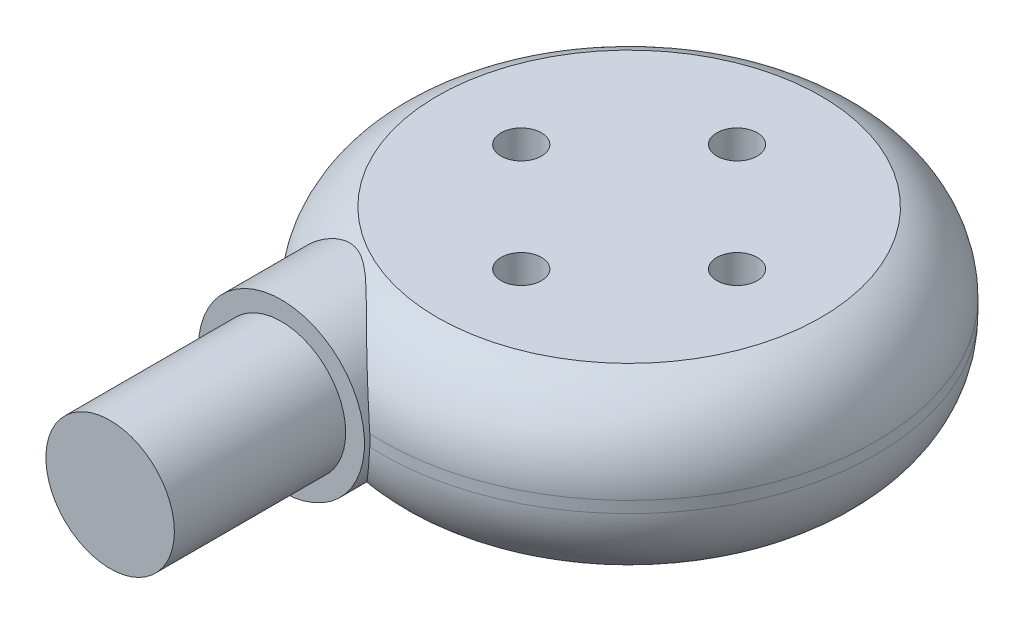
ISO-10303-21;
HEADER;
FILE_DESCRIPTION(('STEP AP214'),'2;1');
FILE_NAME('part.step','',(''),(''),'','','');
FILE_SCHEMA(('AUTOMOTIVE_DESIGN { 1 0 10303 214 1 1 1 1 }'));
ENDSEC;
DATA;
#1=APPLICATION_CONTEXT('core data for automotive mechanical design processes');
#2=APPLICATION_PROTOCOL_DEFINITION('international standard','automotive_design',2000,#1);
#3=PRODUCT_CONTEXT('',#1,'mechanical');
#4=PRODUCT('Part','Part','',(#3));
#5=PRODUCT_RELATED_PRODUCT_CATEGORY('part','',(#4));
#6=PRODUCT_DEFINITION_FORMATION('','',#4);
#7=PRODUCT_DEFINITION_CONTEXT('part definition',#1,'design');
#8=PRODUCT_DEFINITION('design','',#6,#7);
#9=PRODUCT_DEFINITION_SHAPE('','',#8);
#10=(LENGTH_UNIT() NAMED_UNIT(*) SI_UNIT(.MILLI.,.METRE.));
#11=(NAMED_UNIT(*) PLANE_ANGLE_UNIT() SI_UNIT($,.RADIAN.));
#12=(NAMED_UNIT(*) SI_UNIT($,.STERADIAN.) SOLID_ANGLE_UNIT());
#13=UNCERTAINTY_MEASURE_WITH_UNIT(LENGTH_MEASURE(1.E-05),#10,'distance_accuracy_value','');
#14=(GEOMETRIC_REPRESENTATION_CONTEXT(3) GLOBAL_UNCERTAINTY_ASSIGNED_CONTEXT((#13)) GLOBAL_UNIT_ASSIGNED_CONTEXT((#10,
#11,#12)) REPRESENTATION_CONTEXT('',''));
#15=CARTESIAN_POINT('',(0.,0.,0.));
#16=DIRECTION('',(0.,0.,1.));
#17=DIRECTION('',(1.,0.,0.));
#18=AXIS2_PLACEMENT_3D('',#15,#16,#17);
#19=CARTESIAN_POINT('',(7.11200000000006,-6.35,-18.6683453434298));
#20=DIRECTION('',(0.,1.,0.));
#21=DIRECTION('',(0.,0.,1.));
#22=AXIS2_PLACEMENT_3D('',#19,#20,#21);
#23=CYLINDRICAL_SURFACE('',#22,14.224);
#24=CARTESIAN_POINT('',(7.11200000000006,-6.35,-18.6683453434298));
#25=DIRECTION('',(0.,1.,0.));
#26=DIRECTION('',(0.,0.,1.));
#27=AXIS2_PLACEMENT_3D('',#24,#25,#26);
#28=CIRCLE('',#27,14.224);
#29=CARTESIAN_POINT('',(7.11200000000006,-6.35,-4.44434534342982));
#30=VERTEX_POINT('',#29);
#31=EDGE_CURVE('E77',#30,#30,#28,.T.);
#32=ORIENTED_EDGE('',*,*,#31,.F.);
#33=EDGE_LOOP('',(#32));
#34=FACE_BOUND('',#33,.T.);
#35=CARTESIAN_POINT('',(7.11200000000006,3.81,-18.6683453434298));
#36=DIRECTION('',(0.,1.,0.));
#37=DIRECTION('',(0.,0.,1.));
#38=AXIS2_PLACEMENT_3D('',#35,#36,#37);
#39=CIRCLE('',#38,14.224);
#40=CARTESIAN_POINT('',(7.11200000000006,3.81,-4.44434534342982));
#41=VERTEX_POINT('',#40);
#42=EDGE_CURVE('E11',#41,#41,#39,.F.);
#43=ORIENTED_EDGE('',*,*,#42,.F.);
#44=EDGE_LOOP('',(#43));
#45=FACE_BOUND('',#44,.T.);
#46=ADVANCED_FACE('F35',(#34,#45),#23,.F.);
#47=CARTESIAN_POINT('',(0.,0.,12.7));
#48=DIRECTION('',(0.,0.,-1.));
#49=DIRECTION('',(-1.,0.,0.));
#50=AXIS2_PLACEMENT_3D('',#47,#48,#49);
#51=CYLINDRICAL_SURFACE('',#50,4.7625);
#52=CARTESIAN_POINT('',(0.,0.,12.7));
#53=DIRECTION('',(0.,0.,1.));
#54=DIRECTION('',(1.,0.,0.));
#55=AXIS2_PLACEMENT_3D('',#52,#53,#54);
#56=CIRCLE('',#55,4.7625);
#57=CARTESIAN_POINT('',(4.7625,0.,12.7));
#58=VERTEX_POINT('',#57);
#59=EDGE_CURVE('E73',#58,#58,#56,.T.);
#60=ORIENTED_EDGE('',*,*,#59,.F.);
#61=EDGE_LOOP('',(#60));
#62=FACE_BOUND('',#61,.T.);
#63=CARTESIAN_POINT('',(0.,0.,0.));
#64=DIRECTION('',(0.,0.,1.));
#65=DIRECTION('',(1.,0.,0.));
#66=AXIS2_PLACEMENT_3D('',#63,#64,#65);
#67=CIRCLE('',#66,4.7625);
#68=CARTESIAN_POINT('',(4.7625,0.,0.));
#69=VERTEX_POINT('',#68);
#70=EDGE_CURVE('E89',#69,#69,#67,.T.);
#71=ORIENTED_EDGE('',*,*,#70,.T.);
#72=EDGE_LOOP('',(#71));
#73=FACE_BOUND('',#72,.T.);
#74=ADVANCED_FACE('F110',(#62,#73),#51,.T.);
#75=CARTESIAN_POINT('',(0.,0.,12.7));
#76=DIRECTION('',(0.,0.,1.));
#77=DIRECTION('',(1.,0.,0.));
#78=AXIS2_PLACEMENT_3D('',#75,#76,#77);
#79=PLANE('',#78);
#80=ORIENTED_EDGE('',*,*,#59,.T.);
#81=EDGE_LOOP('',(#80));
#82=FACE_BOUND('',#81,.T.);
#83=ADVANCED_FACE('F106',(#82),#79,.T.);
#84=CARTESIAN_POINT('',(0.,0.,-6.35));
#85=DIRECTION('',(0.,0.,1.));
#86=DIRECTION('',(1.,0.,0.));
#87=AXIS2_PLACEMENT_3D('',#84,#85,#86);
#88=CYLINDRICAL_SURFACE('',#87,6.1595);
#89=CARTESIAN_POINT('',(6.1595,0.,-0.405166875539851));
#90=CARTESIAN_POINT('',(6.15950023475749,0.172517177616441,-0.40516698536337));
#91=CARTESIAN_POINT('',(6.1522480764625,0.345030274570014,-0.405540795162976));
#92=CARTESIAN_POINT('',(6.12329168071194,0.688838513053254,-0.407085513688974));
#93=CARTESIAN_POINT('',(6.10158740172247,0.860133651081204,-0.408256424706152));
#94=CARTESIAN_POINT('',(6.04388592198765,1.2002640638204,-0.411540871268977));
#95=CARTESIAN_POINT('',(6.00789082466917,1.36909969674991,-0.413654268098328));
#96=CARTESIAN_POINT('',(5.92186630327485,1.70313985580206,-0.419060941484881));
#97=CARTESIAN_POINT('',(5.87183676114572,1.86834435136811,-0.422354227967004));
#98=CARTESIAN_POINT('',(5.75808649293658,2.19400055125028,-0.43044217888493));
#99=CARTESIAN_POINT('',(5.69436084303803,2.35445052262439,-0.435237383552032));
#100=CARTESIAN_POINT('',(5.55370157872006,2.66937797328264,-0.446720119026419));
#101=CARTESIAN_POINT('',(5.47676835961368,2.82385563115336,-0.453407593200457));
#102=CARTESIAN_POINT('',(5.31025529055499,3.12575626978201,-0.469124177525595));
#103=CARTESIAN_POINT('',(5.22067284045019,3.27317779173036,-0.478153769438278));
#104=CARTESIAN_POINT('',(5.0296031864806,3.55980123478894,-0.499036181103156));
#105=CARTESIAN_POINT('',(4.92812061110807,3.69900632017738,-0.510887905038089));
#106=CARTESIAN_POINT('',(4.71468948333986,3.96741237441091,-0.537836793831741));
#107=CARTESIAN_POINT('',(4.60280900103588,4.09666950861489,-0.552913589759298));
#108=CARTESIAN_POINT('',(4.36901318058269,4.34514118259427,-0.586837942350733));
#109=CARTESIAN_POINT('',(4.24710161720228,4.46435946619945,-0.605684084367447));
#110=CARTESIAN_POINT('',(3.99422797763476,4.69196334971641,-0.647611102301973));
#111=CARTESIAN_POINT('',(3.86326586609774,4.80034890731335,-0.670691994760591));
#112=CARTESIAN_POINT('',(3.5934179668648,5.00554866584515,-0.721496916497313));
#113=CARTESIAN_POINT('',(3.45453228979066,5.10236302826836,-0.749220880963433));
#114=CARTESIAN_POINT('',(3.17242691607803,5.28229780213224,-0.80914182442154));
#115=CARTESIAN_POINT('',(3.0293181892273,5.36561973619755,-0.841256457690419));
#116=CARTESIAN_POINT('',(2.73777949406721,5.52007478985453,-0.910541659330212));
#117=CARTESIAN_POINT('',(2.5893477176315,5.59120371940267,-0.947713957893792));
#118=CARTESIAN_POINT('',(2.28852441783152,5.72091917836892,-1.02722238841351));
#119=CARTESIAN_POINT('',(2.13613457945877,5.77951094995005,-1.06955635045346));
#120=CARTESIAN_POINT('',(1.82852787773562,5.88407394516104,-1.15944615865331));
#121=CARTESIAN_POINT('',(1.67330997564562,5.93004042768229,-1.20700395713361));
#122=CARTESIAN_POINT('',(1.36006406757813,6.00965825399879,-1.30765823602099));
#123=CARTESIAN_POINT('',(1.20202349972419,6.0432075220632,-1.36079620637294));
#124=CARTESIAN_POINT('',(0.885488633525701,6.09763487453196,-1.47213471049159));
#125=CARTESIAN_POINT('',(0.726994192619633,6.11850840413887,-1.5303370554711));
#126=CARTESIAN_POINT('',(0.410715445989597,6.14784304223325,-1.65151824050047));
#127=CARTESIAN_POINT('',(0.252931055816868,6.15630566789089,-1.71449649572939));
#128=CARTESIAN_POINT('',(-0.0610234414027107,6.16119945592481,-1.84492136909588));
#129=CARTESIAN_POINT('',(-0.217192913762839,6.15762605570917,-1.91236967222985));
#130=CARTESIAN_POINT('',(-0.538501915397839,6.13817883439698,-2.05648209340827));
#131=CARTESIAN_POINT('',(-0.703447799578635,6.12141248465616,-2.13345871167567));
#132=CARTESIAN_POINT('',(-1.02953699335835,6.07508392730548,-2.29155604748293));
#133=CARTESIAN_POINT('',(-1.19067886502304,6.0455169601635,-2.37267829654866));
#134=CARTESIAN_POINT('',(-1.66712785278035,5.93851757125521,-2.62135721659478));
#135=CARTESIAN_POINT('',(-1.97567651526417,5.84277207016474,-2.79432442769908));
#136=CARTESIAN_POINT('',(-2.6089697447446,5.5914151073666,-3.17294211280872));
#137=CARTESIAN_POINT('',(-2.93042205731185,5.42954118384211,-3.37988218835844));
#138=CARTESIAN_POINT('',(-3.53954567066901,5.05364912327975,-3.79783843479704));
#139=CARTESIAN_POINT('',(-3.82715302757868,4.83953455934721,-4.00886147120846));
#140=CARTESIAN_POINT('',(-4.24436252962896,4.46818882695183,-4.33238153158598));
#141=CARTESIAN_POINT('',(-4.38750919959234,4.32779060434912,-4.44710418140419));
#142=CARTESIAN_POINT('',(-4.66091656701009,4.03185963674266,-4.67260624702949));
#143=CARTESIAN_POINT('',(-4.79117335291069,3.87632232587316,-4.78338445937179));
#144=CARTESIAN_POINT('',(-5.03728504187811,3.55059943666415,-4.99821556795551));
#145=CARTESIAN_POINT('',(-5.1531721280371,3.38044809153186,-5.10228323282625));
#146=CARTESIAN_POINT('',(-5.36928483020561,3.02546015989003,-5.30084764433183));
#147=CARTESIAN_POINT('',(-5.46952244252745,2.84063498739204,-5.39535170233027));
#148=CARTESIAN_POINT('',(-5.67102065013492,2.41748747993959,-5.58902634448849));
#149=CARTESIAN_POINT('',(-5.7684076147289,2.1758950642383,-5.68529176201641));
#150=CARTESIAN_POINT('',(-5.89215829822243,1.79982128494006,-5.80964199742577));
#151=CARTESIAN_POINT('',(-5.92968280036188,1.67220339930003,-5.84774639491108));
#152=CARTESIAN_POINT('',(-5.99675130579239,1.41291094815217,-5.91633057981896));
#153=CARTESIAN_POINT('',(-6.02629930370982,1.28123845013683,-5.94681418316109));
#154=CARTESIAN_POINT('',(-6.07713659255756,1.01323369156753,-5.99952606463506));
#155=CARTESIAN_POINT('',(-6.09833908496332,0.876867715689922,-6.02166748230484));
#156=CARTESIAN_POINT('',(-6.13159348882475,0.601817592629502,-6.05649538938141));
#157=CARTESIAN_POINT('',(-6.1436456388142,0.463133505972202,-6.06918212525543));
#158=CARTESIAN_POINT('',(-6.15830424248134,0.18477862022379,-6.08462233121333));
#159=CARTESIAN_POINT('',(-6.16091527705851,0.0451083326158347,-6.08738061865136));
#160=CARTESIAN_POINT('',(-6.15663775760271,-0.23391574436752,-6.08286934781583));
#161=CARTESIAN_POINT('',(-6.14974997162146,-0.373269558419653,-6.07560060030413));
#162=CARTESIAN_POINT('',(-6.12815168667006,-0.632322775981833,-6.05289714788108));
#163=CARTESIAN_POINT('',(-6.11457348857131,-0.752223991800105,-6.03864575530891));
#164=CARTESIAN_POINT('',(-6.08060229828112,-0.990029875168638,-6.00316547452577));
#165=CARTESIAN_POINT('',(-6.06020718273657,-1.10793390859311,-5.98193441230109));
#166=CARTESIAN_POINT('',(-5.98926396257916,-1.45762005954871,-5.90854393893564));
#167=CARTESIAN_POINT('',(-5.92895129746465,-1.68545292352423,-5.84667999018045));
#168=CARTESIAN_POINT('',(-5.75840893711857,-2.20954414519092,-5.67516037066207));
#169=CARTESIAN_POINT('',(-5.63794204482358,-2.49942789176608,-5.55628248772822));
#170=CARTESIAN_POINT('',(-5.43040675973351,-2.91099600995392,-5.35864138797804));
#171=CARTESIAN_POINT('',(-5.35661847254862,-3.044500809898,-5.28941606894584));
#172=CARTESIAN_POINT('',(-5.20075931763147,-3.30369068164233,-5.14584174094385));
#173=CARTESIAN_POINT('',(-5.11869046278422,-3.42937764189439,-5.07149397855215));
#174=CARTESIAN_POINT('',(-4.91942291369493,-3.71179326448826,-4.89450120235428));
#175=CARTESIAN_POINT('',(-4.79937941112118,-3.8656051378173,-4.79040639266603));
#176=CARTESIAN_POINT('',(-4.54703474164461,-4.15949944018826,-4.57774209620408));
#177=CARTESIAN_POINT('',(-4.41472993503976,-4.29957776694317,-4.46917128609752));
#178=CARTESIAN_POINT('',(-4.13869264377951,-4.56590153154826,-4.24946921086118));
#179=CARTESIAN_POINT('',(-3.99495568023593,-4.69214150128575,-4.13833695443907));
#180=CARTESIAN_POINT('',(-3.69683001116591,-4.93044619011836,-3.91521671587624));
#181=CARTESIAN_POINT('',(-3.54244223806373,-5.04251214764863,-3.8032288094047));
#182=CARTESIAN_POINT('',(-3.22184876193579,-5.25322157277965,-3.57857209796581));
#183=CARTESIAN_POINT('',(-3.0555292003672,-5.35169899962334,-3.46590990518232));
#184=CARTESIAN_POINT('',(-2.71334554917429,-5.53305387428658,-3.24254649940941));
#185=CARTESIAN_POINT('',(-2.53748200732433,-5.61593221619432,-3.13184517435919));
#186=CARTESIAN_POINT('',(-2.17702058829421,-5.76524638203093,-2.91368229468174));
#187=CARTESIAN_POINT('',(-1.99242457171534,-5.83168568994521,-2.80622005782949));
#188=CARTESIAN_POINT('',(-1.61541927596263,-5.94716076340095,-2.5957071103738));
#189=CARTESIAN_POINT('',(-1.42301021089174,-5.99619700548487,-2.49265627904226));
#190=CARTESIAN_POINT('',(-1.03182761869835,-6.07573458462974,-2.29222731875925));
#191=CARTESIAN_POINT('',(-0.833062913781452,-6.10626053218913,-2.19484181396188));
#192=CARTESIAN_POINT('',(-0.430408159210808,-6.1477756130053,-2.00664077392042));
#193=CARTESIAN_POINT('',(-0.226517965916951,-6.15876419811357,-1.91582542307993));
#194=CARTESIAN_POINT('',(0.184353747044207,-6.16016364567831,-1.74178667589674));
#195=CARTESIAN_POINT('',(0.391332258923024,-6.15059337811751,-1.65855639068361));
#196=CARTESIAN_POINT('',(0.806352356554719,-6.11004741154603,-1.5003800762809));
#197=CARTESIAN_POINT('',(1.01439371769442,-6.07907606345436,-1.42543236680478));
#198=CARTESIAN_POINT('',(1.3995703346497,-6.00113238224167,-1.29438698303394));
#199=CARTESIAN_POINT('',(1.5768994884303,-5.95705653947525,-1.23712383406193));
#200=CARTESIAN_POINT('',(1.92876366658994,-5.8526042027949,-1.1292790175091));
#201=CARTESIAN_POINT('',(2.10329902598512,-5.79222967907562,-1.07869654346403));
#202=CARTESIAN_POINT('',(2.44768540203062,-5.65531598546538,-0.98425680607376));
#203=CARTESIAN_POINT('',(2.61753870456748,-5.57878486748182,-0.940396211490997));
#204=CARTESIAN_POINT('',(2.95081921597314,-5.40989799581291,-0.859220366848548));
#205=CARTESIAN_POINT('',(3.11424686145073,-5.31754331959491,-0.821904671479486));
#206=CARTESIAN_POINT('',(3.41642095058297,-5.12795876749887,-0.757035876964892));
#207=CARTESIAN_POINT('',(3.5559732601312,-5.0322174360024,-0.728872542217408));
#208=CARTESIAN_POINT('',(3.82725686009219,-4.82910468592101,-0.677223333869792));
#209=CARTESIAN_POINT('',(3.95898853125678,-4.72173383424531,-0.653737232424843));
#210=CARTESIAN_POINT('',(4.21347834134685,-4.49610464427745,-0.611043014226748));
#211=CARTESIAN_POINT('',(4.33623781163343,-4.37784792721828,-0.591834261899782));
#212=CARTESIAN_POINT('',(4.57177868112596,-4.13126502095225,-0.557232914263276));
#213=CARTESIAN_POINT('',(4.68455992634275,-4.00293867640331,-0.541840377840958));
#214=CARTESIAN_POINT('',(4.89735508113266,-3.73945594962283,-0.514623927462918));
#215=CARTESIAN_POINT('',(4.99755690633777,-3.60445714673233,-0.502742610710782));
#216=CARTESIAN_POINT('',(5.18670641381319,-3.32652702790444,-0.481722510669947));
#217=CARTESIAN_POINT('',(5.27565037507406,-3.18359311155101,-0.472584632795278));
#218=CARTESIAN_POINT('',(5.44158939529478,-2.89082313237553,-0.456601213080544));
#219=CARTESIAN_POINT('',(5.5185841103889,-2.74098687108423,-0.449755737202809));
#220=CARTESIAN_POINT('',(5.66006944943233,-2.43544680373671,-0.437934400055751));
#221=CARTESIAN_POINT('',(5.7245594225978,-2.2797426928036,-0.432958636079146));
#222=CARTESIAN_POINT('',(5.84472184742326,-1.95223509721501,-0.424199943573725));
#223=CARTESIAN_POINT('',(5.89943554320822,-1.78007603278038,-0.420527593826768));
#224=CARTESIAN_POINT('',(5.99354489954996,-1.43158665013316,-0.414517598263686));
#225=CARTESIAN_POINT('',(6.03293925783539,-1.25525597865027,-0.412180065910252));
#226=CARTESIAN_POINT('',(6.09608975452564,-0.899834789318706,-0.40855694915782));
#227=CARTESIAN_POINT('',(6.11984839233364,-0.72074471725249,-0.40727119662159));
#228=CARTESIAN_POINT('',(6.15155612530695,-0.361101929678388,-0.405575950862688));
#229=CARTESIAN_POINT('',(6.15949975431336,-0.180548730109972,-0.405166760603488));
#230=CARTESIAN_POINT('',(6.1595,0.,-0.405166875539851));
#231=B_SPLINE_CURVE_WITH_KNOTS('',3,(#89,#90,#91,#92,#93,#94,#95,#96,#97,#98,#99,#100,#101,#102,
#103,#104,#105,#106,#107,#108,#109,#110,#111,#112,#113,#114,#115,#116,#117,#118,#119,#120,#121,
#122,#123,#124,#125,#126,#127,#128,#129,#130,#131,#132,#133,#134,#135,#136,#137,#138,#139,#140,
#141,#142,#143,#144,#145,#146,#147,#148,#149,#150,#151,#152,#153,#154,#155,#156,#157,#158,#159,
#160,#161,#162,#163,#164,#165,#166,#167,#168,#169,#170,#171,#172,#173,#174,#175,#176,#177,#178,
#179,#180,#181,#182,#183,#184,#185,#186,#187,#188,#189,#190,#191,#192,#193,#194,#195,#196,#197,
#198,#199,#200,#201,#202,#203,#204,#205,#206,#207,#208,#209,#210,#211,#212,#213,#214,#215,#216,
#217,#218,#219,#220,#221,#222,#223,#224,#225,#226,#227,#228,#229,#230),.UNSPECIFIED.,.T.,.F.,(4,
2,2,2,2,2,2,2,2,2,2,2,2,2,2,2,2,2,2,2,2,2,2,2,2,2,2,2,2,2,2,2,2,2,2,2,2,2,2,2,2,2,2,2,2,2,2,2,2,
2,2,2,2,2,2,2,2,2,2,2,2,2,2,2,2,2,2,2,2,2,4),(0.,0.517391943642746,1.03478537422278,
1.55210267927977,2.06942433597609,2.58693228439252,3.10442474608471,3.62202373784692,
4.1394220757596,4.65364433268318,5.1676739613323,5.68170559780802,6.19573005958676,
6.70117845907686,7.20680020579844,7.71221012192571,8.21780957330277,8.7274775558242,
9.23732857011914,9.74711725251241,10.2570992062967,10.804900645386,11.3529059434533,
12.4482044859175,13.688984585885,14.9320725049791,15.6243553091678,16.3168475528266,
17.0077597142071,17.6981396193225,18.5278043656203,18.9425078344834,19.3570032332959,
19.7757024166661,20.1943906848902,20.6128757751687,21.031327029736,21.395425563538,
21.7596376136534,22.4878324796032,23.4890661195517,23.9912660481324,24.493344192022,
25.1558817036454,25.8186165197891,26.481612273273,27.1445500583224,27.8149814052568,
28.4853743135635,29.1556250210848,29.825857373934,30.4951966493068,31.1645547036488,
31.8332986489208,32.5019066760557,33.0755765638006,33.6491771370018,34.2224925188167,
34.7957688775958,35.3098394382693,35.8238849505925,36.3378540295459,36.8518310389542,
37.3568700998369,37.8620756554291,38.3672957467234,38.8725421241164,39.4138747944515,
39.9552534725199,40.4965455890204,41.038024760454),.UNSPECIFIED.);
#232=CARTESIAN_POINT('',(6.14476807858262,-0.425752874837175,-0.405941164072959));
#233=VERTEX_POINT('',#232);
#234=CARTESIAN_POINT('',(6.14476807858262,0.425752874837175,-0.405941164072959));
#235=VERTEX_POINT('',#234);
#236=EDGE_CURVE('E70',#233,#235,#231,.T.);
#237=ORIENTED_EDGE('',*,*,#236,.T.);
#238=CARTESIAN_POINT('',(6.14476807858262,0.425752874837175,-0.405941164072957));
#239=CARTESIAN_POINT('',(6.13530208580406,0.56288340509565,-0.406415114659884));
#240=CARTESIAN_POINT('',(6.12118010591251,0.699646205187014,-0.411644664773204));
#241=CARTESIAN_POINT('',(6.08398773758386,0.971173687146657,-0.43129993511688));
#242=CARTESIAN_POINT('',(6.06092451745192,1.10593988008848,-0.445718294509901));
#243=CARTESIAN_POINT('',(6.00642152950099,1.37134110056123,-0.483283126786642));
#244=CARTESIAN_POINT('',(5.97505205769644,1.50200095459201,-0.50635700071804));
#245=CARTESIAN_POINT('',(5.90438448978411,1.75940185927113,-0.560776141932942));
#246=CARTESIAN_POINT('',(5.86508518933018,1.88614231128258,-0.592122665851642));
#247=CARTESIAN_POINT('',(5.77932133114041,2.13449917715262,-0.662426179288705));
#248=CARTESIAN_POINT('',(5.73288055162776,2.25613094948687,-0.701358023626835));
#249=CARTESIAN_POINT('',(5.63341869550911,2.49413245841472,-0.786296142052627));
#250=CARTESIAN_POINT('',(5.58039503579252,2.61050010478187,-0.832305194927713));
#251=CARTESIAN_POINT('',(5.41229433253896,2.95138226572453,-0.980200297227338));
#252=CARTESIAN_POINT('',(5.28828363561593,3.16740409541408,-1.09187535641053));
#253=CARTESIAN_POINT('',(5.06154240941345,3.51420787691767,-1.29996457514584));
#254=CARTESIAN_POINT('',(4.96336407942572,3.65130546456681,-1.3911252826159));
#255=CARTESIAN_POINT('',(4.75951969992299,3.91330238955681,-1.58236888075097));
#256=CARTESIAN_POINT('',(4.65385046167287,4.0381964776457,-1.68245557577151));
#257=CARTESIAN_POINT('',(4.43629698432069,4.27606720282959,-1.89025708642326));
#258=CARTESIAN_POINT('',(4.32440277444485,4.38902382831518,-1.9979842205789));
#259=CARTESIAN_POINT('',(4.09571131933846,4.60316387272943,-2.21962172283241));
#260=CARTESIAN_POINT('',(3.97891505024339,4.70434962057149,-2.3335308612339));
#261=CARTESIAN_POINT('',(3.68788642482934,4.93840036783235,-2.61872133357434));
#262=CARTESIAN_POINT('',(3.51141175266088,5.06508990055418,-2.7927983573638));
#263=CARTESIAN_POINT('',(3.15157757133287,5.29648982032761,-3.1483678475132));
#264=CARTESIAN_POINT('',(2.96821374294361,5.40118613798102,-3.3298649724879));
#265=CARTESIAN_POINT('',(2.59489001116506,5.59015762929436,-3.69715149553676));
#266=CARTESIAN_POINT('',(2.40492256287339,5.67440850371593,-3.88294571633953));
#267=CARTESIAN_POINT('',(2.11448684624632,5.78611272603308,-4.16159313877036));
#268=CARTESIAN_POINT('',(2.0167772196974,5.82089764464583,-4.25445316557497));
#269=CARTESIAN_POINT('',(1.81918224117857,5.88564650871562,-4.43953105607542));
#270=CARTESIAN_POINT('',(1.71929711745373,5.91561095717847,-4.5317489858107));
#271=CARTESIAN_POINT('',(1.51185077350935,5.972091604319,-4.71934650562611));
#272=CARTESIAN_POINT('',(1.40415564925085,5.99835995712666,-4.8146531423831));
#273=CARTESIAN_POINT('',(1.18523551246571,6.04542742141218,-5.00250036188783));
#274=CARTESIAN_POINT('',(1.07401130790111,6.06622777477427,-5.09504156847694));
#275=CARTESIAN_POINT('',(0.847439937743986,6.10200077996025,-5.27561368454692));
#276=CARTESIAN_POINT('',(0.732102703715935,6.11698655263678,-5.3636543549419));
#277=CARTESIAN_POINT('',(0.496203912803063,6.14062430205376,-5.53339223410678));
#278=CARTESIAN_POINT('',(0.375644114487855,6.1492783935398,-5.61509155269514));
#279=CARTESIAN_POINT('',(0.160205915462936,6.15810277869769,-5.74985794933742));
#280=CARTESIAN_POINT('',(0.0666378809035396,6.15987594371269,-5.80490655947773));
#281=CARTESIAN_POINT('',(-0.123789650992836,6.15899148319317,-5.9089141551424));
#282=CARTESIAN_POINT('',(-0.220647839572797,6.15633559968672,-5.95787552675379));
#283=CARTESIAN_POINT('',(-0.417196101749972,6.14614041904773,-6.04855232921898));
#284=CARTESIAN_POINT('',(-0.516878943309574,6.13861267544709,-6.09028460768941));
#285=CARTESIAN_POINT('',(-0.718668759904325,6.11827040624703,-6.16588022027836));
#286=CARTESIAN_POINT('',(-0.820775633352204,6.10545610183153,-6.1997438835185));
#287=CARTESIAN_POINT('',(-1.02674811768303,6.07421618602845,-6.25942304924304));
#288=CARTESIAN_POINT('',(-1.1306174343381,6.0557768607887,-6.28521856670546));
#289=CARTESIAN_POINT('',(-1.33882351313162,6.01317596901201,-6.32897547032093));
#290=CARTESIAN_POINT('',(-1.44316030830897,5.98901399156421,-6.34693629364619));
#291=CARTESIAN_POINT('',(-1.6516403663822,5.93491027467358,-6.37586417227906));
#292=CARTESIAN_POINT('',(-1.75578198758889,5.90495059003062,-6.38680904590354));
#293=CARTESIAN_POINT('',(-1.96276239626946,5.83941779113646,-6.4026822982252));
#294=CARTESIAN_POINT('',(-2.06560070305519,5.80384266735613,-6.40760851756255));
#295=CARTESIAN_POINT('',(-2.31103865170313,5.71157152345924,-6.4135874245003));
#296=CARTESIAN_POINT('',(-2.45269037013238,5.65218943325297,-6.4122304541092));
#297=CARTESIAN_POINT('',(-2.73097953285079,5.52311044454514,-6.40271278767443));
#298=CARTESIAN_POINT('',(-2.86761489676241,5.45340932552664,-6.39454930138534));
#299=CARTESIAN_POINT('',(-3.13512351751645,5.30414116405948,-6.37378205224865));
#300=CARTESIAN_POINT('',(-3.2659932750125,5.22456823888062,-6.36117563348722));
#301=CARTESIAN_POINT('',(-3.52125900940452,5.05604299920362,-6.33337332145515));
#302=CARTESIAN_POINT('',(-3.64565444357585,4.96708990027673,-6.31817721155279));
#303=CARTESIAN_POINT('',(-3.89137180648165,4.77719157109849,-6.2861060219712));
#304=CARTESIAN_POINT('',(-4.0124583816535,4.67594830810758,-6.2691921774652));
#305=CARTESIAN_POINT('',(-4.24650770736908,4.46446963312788,-6.23534399811305));
#306=CARTESIAN_POINT('',(-4.35947022255367,4.35423396082063,-6.21840966268771));
#307=CARTESIAN_POINT('',(-4.57663305769694,4.12537800967587,-6.18547632984934));
#308=CARTESIAN_POINT('',(-4.68083612569614,4.00676038210824,-6.16947703957476));
#309=CARTESIAN_POINT('',(-4.87992276560394,3.7617433620179,-6.13916318389054));
#310=CARTESIAN_POINT('',(-4.97480624516181,3.63534389240265,-6.12484863517525));
#311=CARTESIAN_POINT('',(-5.16377715961077,3.36230867989612,-6.09718278391041));
#312=CARTESIAN_POINT('',(-5.25681434402162,3.21491899102331,-6.08407516720747));
#313=CARTESIAN_POINT('',(-5.43012678652196,2.91264580054574,-6.0613077449657));
#314=CARTESIAN_POINT('',(-5.51040723547581,2.75776538064301,-6.05164653504119));
#315=CARTESIAN_POINT('',(-5.65759677320975,2.44160452972939,-6.03629430068992));
#316=CARTESIAN_POINT('',(-5.72450787174175,2.28032506503248,-6.03060267921264));
#317=CARTESIAN_POINT('',(-5.84440036095606,1.95265536224069,-6.02361291928215));
#318=CARTESIAN_POINT('',(-5.89738661418912,1.78626693092347,-6.02231324527748));
#319=CARTESIAN_POINT('',(-5.99631554270848,1.4228397574083,-6.02461477377781));
#320=CARTESIAN_POINT('',(-6.03980656374481,1.22512680829777,-6.0290263322828));
#321=CARTESIAN_POINT('',(-6.09025789091843,0.92649603218879,-6.0406959750025));
#322=CARTESIAN_POINT('',(-6.10460688513783,0.826665496331153,-6.04542383802959));
#323=CARTESIAN_POINT('',(-6.12838221714958,0.626516743933342,-6.05659785411118));
#324=CARTESIAN_POINT('',(-6.13780860985404,0.526198532845834,-6.06304398799697));
#325=CARTESIAN_POINT('',(-6.14476807858262,0.425752874837176,-6.07036756480712));
#326=B_SPLINE_CURVE_WITH_KNOTS('',3,(#238,#239,#240,#241,#242,#243,#244,#245,#246,#247,#248,
#249,#250,#251,#252,#253,#254,#255,#256,#257,#258,#259,#260,#261,#262,#263,#264,#265,#266,#267,
#268,#269,#270,#271,#272,#273,#274,#275,#276,#277,#278,#279,#280,#281,#282,#283,#284,#285,#286,
#287,#288,#289,#290,#291,#292,#293,#294,#295,#296,#297,#298,#299,#300,#301,#302,#303,#304,#305,
#306,#307,#308,#309,#310,#311,#312,#313,#314,#315,#316,#317,#318,#319,#320,#321,#322,#323,#324,
#325),.UNSPECIFIED.,.F.,.F.,(4,2,2,2,2,2,2,2,2,2,2,2,2,2,2,2,2,2,2,2,2,2,2,2,2,2,2,2,2,2,2,2,2,
2,2,2,2,2,2,2,2,2,2,4),(0.,0.412170963115568,0.824012164638293,1.23247356098038,
1.64099703932801,2.04818863055543,2.4555405110789,3.2711314881922,3.84552970561045,
4.42017391875967,4.99576665797769,5.57124531956467,6.40511684346127,7.23952019416409,
8.07491042214265,8.49246946461107,8.90998490738026,9.34840994380522,9.78673531956464,
10.2240657615304,10.661250070848,10.9867120159266,11.3120459808908,11.6366112351431,
11.9611629113166,12.2865122583328,12.6118849739073,12.9382813818645,13.2647948592661,
13.7249069033512,14.1852076573605,14.6457840398097,15.1063989691257,15.5821512823511,
16.0579173728731,16.5335336431843,17.0091546260508,17.5328596142885,18.0563509521199,
18.5797635366437,19.1029931020917,19.7092447938868,20.012030905462,20.3148136393556),.UNSPECIFIED.);
#327=CARTESIAN_POINT('',(-6.14476807858262,0.425752874837176,-6.07036756480712));
#328=VERTEX_POINT('',#327);
#329=EDGE_CURVE('E44',#235,#328,#326,.T.);
#330=ORIENTED_EDGE('',*,*,#329,.T.);
#331=CARTESIAN_POINT('',(-6.14476807858262,-0.425752874837176,-6.07036756480712));
#332=VERTEX_POINT('',#331);
#333=EDGE_CURVE('E71',#328,#332,#231,.T.);
#334=ORIENTED_EDGE('',*,*,#333,.T.);
#335=CARTESIAN_POINT('',(-6.14476807858262,-0.425752874837175,-6.07036756480712));
#336=CARTESIAN_POINT('',(-6.13330083192434,-0.591600383910237,-6.05826639393751));
#337=CARTESIAN_POINT('',(-6.11506116739192,-0.757148184739444,-6.04857051725824));
#338=CARTESIAN_POINT('',(-6.06521326218984,-1.08640160992948,-6.03379616510312));
#339=CARTESIAN_POINT('',(-6.03360711331642,-1.25010751842483,-6.02871696752874));
#340=CARTESIAN_POINT('',(-5.95728760947738,-1.57411003621126,-6.0229857908314));
#341=CARTESIAN_POINT('',(-5.9126048932899,-1.73441368592613,-6.02232354798387));
#342=CARTESIAN_POINT('',(-5.81043076741092,-2.0508466615109,-6.02513282136779));
#343=CARTESIAN_POINT('',(-5.75293928236434,-2.20697596281672,-6.02860436191915));
#344=CARTESIAN_POINT('',(-5.62557688549604,-2.51394882132793,-6.03935116895906));
#345=CARTESIAN_POINT('',(-5.55570685547293,-2.6647927541259,-6.04662616457648));
#346=CARTESIAN_POINT('',(-5.40409926768633,-2.96018820076601,-6.06457149257666));
#347=CARTESIAN_POINT('',(-5.32236112926652,-3.10473940628158,-6.07524199111748));
#348=CARTESIAN_POINT('',(-5.14758989641834,-3.3866307512211,-6.09947934773809));
#349=CARTESIAN_POINT('',(-5.05455419311027,-3.52396921452047,-6.11304687536231));
#350=CARTESIAN_POINT('',(-4.85784761713459,-3.79054043085278,-6.14245848116699));
#351=CARTESIAN_POINT('',(-4.75417677240586,-3.91977320517819,-6.15830255336693));
#352=CARTESIAN_POINT('',(-4.53442538897862,-4.17217617764447,-6.19187469467417));
#353=CARTESIAN_POINT('',(-4.41811788914784,-4.2951441962701,-6.20963716688062));
#354=CARTESIAN_POINT('',(-4.17582599357268,-4.53106051135268,-6.24570512351097));
#355=CARTESIAN_POINT('',(-4.04984143481829,-4.6440086389555,-6.26401061707887));
#356=CARTESIAN_POINT('',(-3.7888597205793,-4.85928159194013,-6.29983670495773));
#357=CARTESIAN_POINT('',(-3.65385681027885,-4.96159952547743,-6.31735678593179));
#358=CARTESIAN_POINT('',(-3.3756847671283,-5.15488732603683,-6.34983766471991));
#359=CARTESIAN_POINT('',(-3.23251752345327,-5.24585980292364,-6.36479905142117));
#360=CARTESIAN_POINT('',(-2.97344511624749,-5.39582154844918,-6.38685553277355));
#361=CARTESIAN_POINT('',(-2.85906070791934,-5.45729726720876,-6.39497339498));
#362=CARTESIAN_POINT('',(-2.62646205249278,-5.57297022951053,-6.40697628796902));
#363=CARTESIAN_POINT('',(-2.5082487212507,-5.62716919788261,-6.41086232339259));
#364=CARTESIAN_POINT('',(-2.26883067776573,-5.72788577788084,-6.4127750412822));
#365=CARTESIAN_POINT('',(-2.14763312302447,-5.77442003530557,-6.41081460268824));
#366=CARTESIAN_POINT('',(-1.9028574036177,-5.85963718923488,-6.39920257925363));
#367=CARTESIAN_POINT('',(-1.7792799369488,-5.89832235050603,-6.38955321693443));
#368=CARTESIAN_POINT('',(-1.55518264452832,-5.96084068819957,-6.36350503391613));
#369=CARTESIAN_POINT('',(-1.4548652427277,-5.98609900185725,-6.34878912017535));
#370=CARTESIAN_POINT('',(-1.25431652242232,-6.03130900351869,-6.31234847424009));
#371=CARTESIAN_POINT('',(-1.15408518799095,-6.05126212201763,-6.29062563489962));
#372=CARTESIAN_POINT('',(-0.954807269985089,-6.0858847269007,-6.23973927326711));
#373=CARTESIAN_POINT('',(-0.855758779412641,-6.1005642958231,-6.21059013381168));
#374=CARTESIAN_POINT('',(-0.659536312116684,-6.12488628030247,-6.14483036746544));
#375=CARTESIAN_POINT('',(-0.56236253922213,-6.1345281510744,-6.10821893418468));
#376=CARTESIAN_POINT('',(-0.348630303035779,-6.15076135075998,-6.01881426276205));
#377=CARTESIAN_POINT('',(-0.232726800927179,-6.15614902161387,-5.96423528885135));
#378=CARTESIAN_POINT('',(-0.00547701919014988,-6.16054777433171,-5.8460991340267));
#379=CARTESIAN_POINT('',(0.105867423939691,-6.15955631147024,-5.78253838004509));
#380=CARTESIAN_POINT('',(0.324556352090774,-6.15192194146361,-5.64798541683616));
#381=CARTESIAN_POINT('',(0.431875660480188,-6.145248188061,-5.57695450410243));
#382=CARTESIAN_POINT('',(0.642338758246119,-6.12682679487656,-5.42951525667368));
#383=CARTESIAN_POINT('',(0.745480357200686,-6.11507653014097,-5.35310415713349));
#384=CARTESIAN_POINT('',(0.950098206778237,-6.08667655666248,-5.19492225535142));
#385=CARTESIAN_POINT('',(1.0515031158607,-6.06993605227132,-5.11307614210005));
#386=CARTESIAN_POINT('',(1.25113762533931,-6.03194837230575,-4.94666880611913));
#387=CARTESIAN_POINT('',(1.3493677094371,-6.01070188700724,-4.86210800093792));
#388=CARTESIAN_POINT('',(1.64039171504755,-5.94041512900557,-4.60567018482806));
#389=CARTESIAN_POINT('',(1.82933737399095,-5.88485383362792,-4.431183919221));
#390=CARTESIAN_POINT('',(2.19998924668884,-5.75655020307664,-4.08085697293718));
#391=CARTESIAN_POINT('',(2.38169378386762,-5.68380391567174,-3.905015989713));
#392=CARTESIAN_POINT('',(2.73912584272091,-5.52043489791957,-3.55575288049935));
#393=CARTESIAN_POINT('',(2.91485711871698,-5.42982364910959,-3.38232927714522));
#394=CARTESIAN_POINT('',(3.23085350708619,-5.24674841409,-3.07008261515703));
#395=CARTESIAN_POINT('',(3.37202898910679,-5.15727179693924,-2.9304297768472));
#396=CARTESIAN_POINT('',(3.64994295504854,-4.96447069227984,-2.65625934262296));
#397=CARTESIAN_POINT('',(3.78668080516675,-4.86114423739133,-2.52174247977216));
#398=CARTESIAN_POINT('',(4.05446942310196,-4.6401253816825,-2.25975643822589));
#399=CARTESIAN_POINT('',(4.18553268293037,-4.52246696579862,-2.13227158975292));
#400=CARTESIAN_POINT('',(4.44091361734658,-4.27197362076424,-1.88576300193149));
#401=CARTESIAN_POINT('',(4.56523116999004,-4.13913841739277,-1.76673941552795));
#402=CARTESIAN_POINT('',(4.85938065069687,-3.7944135287815,-1.487848447763));
#403=CARTESIAN_POINT('',(5.024630661994,-3.57378093734768,-1.33359285890134));
#404=CARTESIAN_POINT('',(5.25371906680298,-3.218351814002,-1.12374923467153));
#405=CARTESIAN_POINT('',(5.32695776429201,-3.09578062236725,-1.05738522638485));
#406=CARTESIAN_POINT('',(5.46622025873876,-2.84265933895364,-0.932703382867775));
#407=CARTESIAN_POINT('',(5.53224542937735,-2.71211077372527,-0.874384015129145));
#408=CARTESIAN_POINT('',(5.64580562524727,-2.46568065376273,-0.775631777612591));
#409=CARTESIAN_POINT('',(5.69459539709847,-2.35092101653189,-0.733834806150939));
#410=CARTESIAN_POINT('',(5.78575487199471,-2.11666431586816,-0.657095837552476));
#411=CARTESIAN_POINT('',(5.82812583914518,-1.99716819109244,-0.622152490277333));
#412=CARTESIAN_POINT('',(5.90578945742583,-1.75423059650059,-0.559695983346486));
#413=CARTESIAN_POINT('',(5.94109385106698,-1.63079607366206,-0.532170470672859));
#414=CARTESIAN_POINT('',(6.00416836491674,-1.38059423553989,-0.484948546306346));
#415=CARTESIAN_POINT('',(6.03194175694481,-1.25382839387806,-0.465248733028223));
#416=CARTESIAN_POINT('',(6.07714861100574,-1.01065054490086,-0.435610138019909));
#417=CARTESIAN_POINT('',(6.09533930743031,-0.894473878580298,-0.424891064252227));
#418=CARTESIAN_POINT('',(6.12508053041224,-0.660871731160956,-0.410265388090816));
#419=CARTESIAN_POINT('',(6.1366322194669,-0.543446472361851,-0.406357592791187));
#420=CARTESIAN_POINT('',(6.14476807858262,-0.425752874837175,-0.405941164072958));
#421=B_SPLINE_CURVE_WITH_KNOTS('',3,(#335,#336,#337,#338,#339,#340,#341,#342,#343,#344,#345,
#346,#347,#348,#349,#350,#351,#352,#353,#354,#355,#356,#357,#358,#359,#360,#361,#362,#363,#364,
#365,#366,#367,#368,#369,#370,#371,#372,#373,#374,#375,#376,#377,#378,#379,#380,#381,#382,#383,
#384,#385,#386,#387,#388,#389,#390,#391,#392,#393,#394,#395,#396,#397,#398,#399,#400,#401,#402,
#403,#404,#405,#406,#407,#408,#409,#410,#411,#412,#413,#414,#415,#416,#417,#418,#419,#420),
.UNSPECIFIED.,.F.,.F.,(4,2,2,2,2,2,2,2,2,2,2,2,2,2,2,2,2,2,2,2,2,2,2,2,2,2,2,2,2,2,2,2,2,2,2,2,
2,2,2,2,2,2,4),(0.,0.499887106635208,0.999696012060429,1.49834310036961,1.99699312233919,
2.49560763672454,2.99424655443426,3.4930008396329,3.99175381462069,4.50174331652528,
5.01174141108601,5.52206811463746,6.03227720723139,6.42232083203926,6.81227183979948,
7.20136447664091,7.59034468511123,7.90347946698719,8.21652972923741,8.52897824239814,
8.84146053726905,9.22547845111779,9.60964956456486,9.99591954149166,10.3823894897328,
10.7763716344641,11.1702934682,11.9588395847795,12.7475672292817,13.5357896133119,
14.1887231436836,14.8417495222431,15.4932564898625,16.1447752310633,17.0883851699043,
17.5602936063881,18.0321120195476,18.4262835526092,18.8203773571894,19.213810758712,
19.6070729595018,19.9609286919078,20.3147224449038),.UNSPECIFIED.);
#422=EDGE_CURVE('E51',#332,#233,#421,.T.);
#423=ORIENTED_EDGE('',*,*,#422,.T.);
#424=EDGE_LOOP('',(#237,#330,#334,#423));
#425=FACE_BOUND('',#424,.T.);
#426=CARTESIAN_POINT('',(0.,0.,0.));
#427=DIRECTION('',(0.,0.,-1.));
#428=DIRECTION('',(-1.,0.,0.));
#429=AXIS2_PLACEMENT_3D('',#426,#427,#428);
#430=CIRCLE('',#429,6.1595);
#431=CARTESIAN_POINT('',(-6.1595,0.,0.));
#432=VERTEX_POINT('',#431);
#433=EDGE_CURVE('E79',#432,#432,#430,.T.);
#434=ORIENTED_EDGE('',*,*,#433,.T.);
#435=EDGE_LOOP('',(#434));
#436=FACE_BOUND('',#435,.T.);
#437=ADVANCED_FACE('F75',(#425,#436),#88,.T.);
#438=CARTESIAN_POINT('',(0.,0.,0.));
#439=DIRECTION('',(0.,0.,-1.));
#440=DIRECTION('',(-1.,0.,0.));
#441=AXIS2_PLACEMENT_3D('',#438,#439,#440);
#442=PLANE('',#441);
#443=ORIENTED_EDGE('',*,*,#70,.F.);
#444=EDGE_LOOP('',(#443));
#445=FACE_BOUND('',#444,.T.);
#446=ORIENTED_EDGE('',*,*,#433,.F.);
#447=EDGE_LOOP('',(#446));
#448=FACE_BOUND('',#447,.T.);
#449=ADVANCED_FACE('F99',(#445,#448),#442,.F.);
#450=CARTESIAN_POINT('',(7.11200000000006,-6.35,-18.6683453434298));
#451=DIRECTION('',(0.,1.,0.));
#452=DIRECTION('',(0.,0.,1.));
#453=AXIS2_PLACEMENT_3D('',#450,#451,#452);
#454=CYLINDRICAL_SURFACE('',#453,18.288);
#455=ORIENTED_EDGE('',*,*,#236,.F.);
#456=CARTESIAN_POINT('',(7.11200000000006,-0.425752874837175,-18.6683453434298));
#457=DIRECTION('',(0.,-1.,0.));
#458=DIRECTION('',(0.,0.,-1.));
#459=AXIS2_PLACEMENT_3D('',#456,#457,#458);
#460=CIRCLE('',#459,18.288);
#461=EDGE_CURVE('E72',#233,#332,#460,.F.);
#462=ORIENTED_EDGE('',*,*,#461,.T.);
#463=ORIENTED_EDGE('',*,*,#333,.F.);
#464=CARTESIAN_POINT('',(7.11200000000006,0.425752874837175,-18.6683453434298));
#465=DIRECTION('',(0.,1.,0.));
#466=DIRECTION('',(0.,0.,1.));
#467=AXIS2_PLACEMENT_3D('',#464,#465,#466);
#468=CIRCLE('',#467,18.288);
#469=EDGE_CURVE('E66',#328,#235,#468,.F.);
#470=ORIENTED_EDGE('',*,*,#469,.T.);
#471=EDGE_LOOP('',(#455,#462,#463,#470));
#472=FACE_BOUND('',#471,.T.);
#473=ADVANCED_FACE('F69',(#472),#454,.T.);
#474=CARTESIAN_POINT('',(7.11200000000006,-0.425752874837175,-18.6683453434298));
#475=DIRECTION('',(0.,-1.,0.));
#476=DIRECTION('',(0.,0.,-1.));
#477=AXIS2_PLACEMENT_3D('',#474,#475,#476);
#478=TOROIDAL_SURFACE('',#477,11.938,6.35);
#479=ORIENTED_EDGE('',*,*,#31,.T.);
#480=EDGE_LOOP('',(#479));
#481=FACE_BOUND('',#480,.T.);
#482=ORIENTED_EDGE('',*,*,#422,.F.);
#483=ORIENTED_EDGE('',*,*,#461,.F.);
#484=EDGE_LOOP('',(#482,#483));
#485=FACE_BOUND('',#484,.T.);
#486=ADVANCED_FACE('F98',(#481,#485),#478,.T.);
#487=CARTESIAN_POINT('',(7.11200000000006,0.425752874837175,-18.6683453434298));
#488=DIRECTION('',(0.,1.,0.));
#489=DIRECTION('',(0.,0.,1.));
#490=AXIS2_PLACEMENT_3D('',#487,#488,#489);
#491=TOROIDAL_SURFACE('',#490,11.938,6.35);
#492=ORIENTED_EDGE('',*,*,#329,.F.);
#493=ORIENTED_EDGE('',*,*,#469,.F.);
#494=EDGE_LOOP('',(#492,#493));
#495=FACE_BOUND('',#494,.T.);
#496=CARTESIAN_POINT('',(7.11200000000006,6.35,-18.6683453434298));
#497=DIRECTION('',(0.,1.,0.));
#498=DIRECTION('',(0.,0.,1.));
#499=AXIS2_PLACEMENT_3D('',#496,#497,#498);
#500=CIRCLE('',#499,14.224);
#501=CARTESIAN_POINT('',(7.11200000000006,6.35,-4.44434534342982));
#502=VERTEX_POINT('',#501);
#503=EDGE_CURVE('E81',#502,#502,#500,.T.);
#504=ORIENTED_EDGE('',*,*,#503,.F.);
#505=EDGE_LOOP('',(#504));
#506=FACE_BOUND('',#505,.T.);
#507=ADVANCED_FACE('F37',(#495,#506),#491,.T.);
#508=CARTESIAN_POINT('',(7.11200000000006,6.35,-18.6683453434298));
#509=DIRECTION('',(0.,1.,0.));
#510=DIRECTION('',(0.,0.,1.));
#511=AXIS2_PLACEMENT_3D('',#508,#509,#510);
#512=PLANE('',#511);
#513=CARTESIAN_POINT('',(-0.887999999999944,6.35,-18.6683453434298));
#514=DIRECTION('',(0.,-1.,0.));
#515=DIRECTION('',(0.,0.,-1.));
#516=AXIS2_PLACEMENT_3D('',#513,#514,#515);
#517=CIRCLE('',#516,1.5);
#518=CARTESIAN_POINT('',(-0.887999999999944,6.35,-20.1683453434298));
#519=VERTEX_POINT('',#518);
#520=EDGE_CURVE('E155',#519,#519,#517,.T.);
#521=ORIENTED_EDGE('',*,*,#520,.T.);
#522=EDGE_LOOP('',(#521));
#523=FACE_BOUND('',#522,.T.);
#524=CARTESIAN_POINT('',(15.1120000000001,6.35,-18.6683453434298));
#525=DIRECTION('',(0.,-1.,0.));
#526=DIRECTION('',(0.,0.,-1.));
#527=AXIS2_PLACEMENT_3D('',#524,#525,#526);
#528=CIRCLE('',#527,1.5);
#529=CARTESIAN_POINT('',(15.1120000000001,6.35,-20.1683453434298));
#530=VERTEX_POINT('',#529);
#531=EDGE_CURVE('E158',#530,#530,#528,.T.);
#532=ORIENTED_EDGE('',*,*,#531,.T.);
#533=EDGE_LOOP('',(#532));
#534=FACE_BOUND('',#533,.T.);
#535=CARTESIAN_POINT('',(7.11200000000006,6.35,-10.6683453434298));
#536=DIRECTION('',(0.,-1.,0.));
#537=DIRECTION('',(0.,0.,-1.));
#538=AXIS2_PLACEMENT_3D('',#535,#536,#537);
#539=CIRCLE('',#538,1.5);
#540=CARTESIAN_POINT('',(7.11200000000006,6.35,-12.1683453434298));
#541=VERTEX_POINT('',#540);
#542=EDGE_CURVE('E167',#541,#541,#539,.T.);
#543=ORIENTED_EDGE('',*,*,#542,.T.);
#544=EDGE_LOOP('',(#543));
#545=FACE_BOUND('',#544,.T.);
#546=CARTESIAN_POINT('',(7.11200000000006,6.35,-26.6683453434298));
#547=DIRECTION('',(0.,-1.,0.));
#548=DIRECTION('',(0.,0.,-1.));
#549=AXIS2_PLACEMENT_3D('',#546,#547,#548);
#550=CIRCLE('',#549,1.5);
#551=CARTESIAN_POINT('',(7.11200000000006,6.35,-28.1683453434298));
#552=VERTEX_POINT('',#551);
#553=EDGE_CURVE('E173',#552,#552,#550,.T.);
#554=ORIENTED_EDGE('',*,*,#553,.T.);
#555=EDGE_LOOP('',(#554));
#556=FACE_BOUND('',#555,.T.);
#557=ORIENTED_EDGE('',*,*,#503,.T.);
#558=EDGE_LOOP('',(#557));
#559=FACE_BOUND('',#558,.T.);
#560=ADVANCED_FACE('F126',(#523,#534,#545,#556,#559),#512,.T.);
#561=CARTESIAN_POINT('',(7.11200000000006,3.81,-18.6683453434298));
#562=DIRECTION('',(0.,1.,0.));
#563=DIRECTION('',(0.,0.,1.));
#564=AXIS2_PLACEMENT_3D('',#561,#562,#563);
#565=PLANE('',#564);
#566=CARTESIAN_POINT('',(-0.887999999999944,3.81,-18.6683453434298));
#567=DIRECTION('',(0.,-1.,0.));
#568=DIRECTION('',(0.,0.,-1.));
#569=AXIS2_PLACEMENT_3D('',#566,#567,#568);
#570=CIRCLE('',#569,1.5);
#571=CARTESIAN_POINT('',(-0.887999999999944,3.81,-20.1683453434298));
#572=VERTEX_POINT('',#571);
#573=EDGE_CURVE('E157',#572,#572,#570,.T.);
#574=ORIENTED_EDGE('',*,*,#573,.F.);
#575=EDGE_LOOP('',(#574));
#576=FACE_BOUND('',#575,.T.);
#577=CARTESIAN_POINT('',(15.1120000000001,3.81,-18.6683453434298));
#578=DIRECTION('',(0.,-1.,0.));
#579=DIRECTION('',(0.,0.,-1.));
#580=AXIS2_PLACEMENT_3D('',#577,#578,#579);
#581=CIRCLE('',#580,1.5);
#582=CARTESIAN_POINT('',(15.1120000000001,3.81,-20.1683453434298));
#583=VERTEX_POINT('',#582);
#584=EDGE_CURVE('E162',#583,#583,#581,.T.);
#585=ORIENTED_EDGE('',*,*,#584,.F.);
#586=EDGE_LOOP('',(#585));
#587=FACE_BOUND('',#586,.T.);
#588=CARTESIAN_POINT('',(7.11200000000006,3.81,-10.6683453434298));
#589=DIRECTION('',(0.,-1.,0.));
#590=DIRECTION('',(0.,0.,-1.));
#591=AXIS2_PLACEMENT_3D('',#588,#589,#590);
#592=CIRCLE('',#591,1.5);
#593=CARTESIAN_POINT('',(7.11200000000006,3.81,-12.1683453434298));
#594=VERTEX_POINT('',#593);
#595=EDGE_CURVE('E170',#594,#594,#592,.T.);
#596=ORIENTED_EDGE('',*,*,#595,.F.);
#597=EDGE_LOOP('',(#596));
#598=FACE_BOUND('',#597,.T.);
#599=CARTESIAN_POINT('',(7.11200000000006,3.81,-26.6683453434298));
#600=DIRECTION('',(0.,-1.,0.));
#601=DIRECTION('',(0.,0.,-1.));
#602=AXIS2_PLACEMENT_3D('',#599,#600,#601);
#603=CIRCLE('',#602,1.5);
#604=CARTESIAN_POINT('',(7.11200000000006,3.81,-28.1683453434298));
#605=VERTEX_POINT('',#604);
#606=EDGE_CURVE('E176',#605,#605,#603,.T.);
#607=ORIENTED_EDGE('',*,*,#606,.F.);
#608=EDGE_LOOP('',(#607));
#609=FACE_BOUND('',#608,.T.);
#610=ORIENTED_EDGE('',*,*,#42,.T.);
#611=EDGE_LOOP('',(#610));
#612=FACE_BOUND('',#611,.T.);
#613=ADVANCED_FACE('F123',(#576,#587,#598,#609,#612),#565,.F.);
#614=CARTESIAN_POINT('',(7.11200000000006,6.35,-26.6683453434298));
#615=DIRECTION('',(0.,-1.,0.));
#616=DIRECTION('',(0.,0.,-1.));
#617=AXIS2_PLACEMENT_3D('',#614,#615,#616);
#618=CYLINDRICAL_SURFACE('',#617,1.5);
#619=ORIENTED_EDGE('',*,*,#553,.F.);
#620=EDGE_LOOP('',(#619));
#621=FACE_BOUND('',#620,.T.);
#622=ORIENTED_EDGE('',*,*,#606,.T.);
#623=EDGE_LOOP('',(#622));
#624=FACE_BOUND('',#623,.T.);
#625=ADVANCED_FACE('F125',(#621,#624),#618,.F.);
#626=CARTESIAN_POINT('',(7.11200000000006,6.35,-10.6683453434298));
#627=DIRECTION('',(0.,-1.,0.));
#628=DIRECTION('',(0.,0.,-1.));
#629=AXIS2_PLACEMENT_3D('',#626,#627,#628);
#630=CYLINDRICAL_SURFACE('',#629,1.5);
#631=ORIENTED_EDGE('',*,*,#542,.F.);
#632=EDGE_LOOP('',(#631));
#633=FACE_BOUND('',#632,.T.);
#634=ORIENTED_EDGE('',*,*,#595,.T.);
#635=EDGE_LOOP('',(#634));
#636=FACE_BOUND('',#635,.T.);
#637=ADVANCED_FACE('F132',(#633,#636),#630,.F.);
#638=CARTESIAN_POINT('',(15.1120000000001,6.35,-18.6683453434298));
#639=DIRECTION('',(0.,-1.,0.));
#640=DIRECTION('',(0.,0.,-1.));
#641=AXIS2_PLACEMENT_3D('',#638,#639,#640);
#642=CYLINDRICAL_SURFACE('',#641,1.5);
#643=ORIENTED_EDGE('',*,*,#531,.F.);
#644=EDGE_LOOP('',(#643));
#645=FACE_BOUND('',#644,.T.);
#646=ORIENTED_EDGE('',*,*,#584,.T.);
#647=EDGE_LOOP('',(#646));
#648=FACE_BOUND('',#647,.T.);
#649=ADVANCED_FACE('F142',(#645,#648),#642,.F.);
#650=CARTESIAN_POINT('',(-0.887999999999944,6.35,-18.6683453434298));
#651=DIRECTION('',(0.,-1.,0.));
#652=DIRECTION('',(0.,0.,-1.));
#653=AXIS2_PLACEMENT_3D('',#650,#651,#652);
#654=CYLINDRICAL_SURFACE('',#653,1.5);
#655=ORIENTED_EDGE('',*,*,#520,.F.);
#656=EDGE_LOOP('',(#655));
#657=FACE_BOUND('',#656,.T.);
#658=ORIENTED_EDGE('',*,*,#573,.T.);
#659=EDGE_LOOP('',(#658));
#660=FACE_BOUND('',#659,.T.);
#661=ADVANCED_FACE('F146',(#657,#660),#654,.F.);
#662=CLOSED_SHELL('',(#46,#74,#83,#437,#449,#473,#486,#507,#560,#613,#625,#637,#649,#661));
#663=MANIFOLD_SOLID_BREP('B2',#662);
#664=ADVANCED_BREP_SHAPE_REPRESENTATION('',(#18,#663),#14);
#665=SHAPE_DEFINITION_REPRESENTATION(#9,#664);
ENDSEC;
END-ISO-10303-21;
